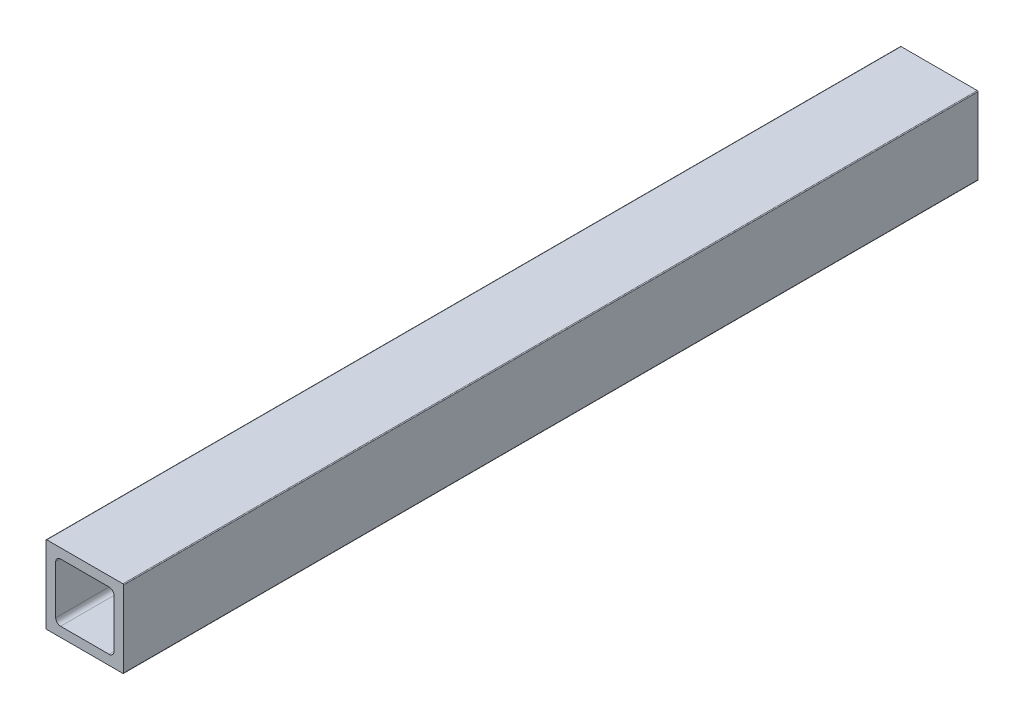
ISO-10303-21;
HEADER;
FILE_DESCRIPTION(('STEP AP214'),'2;1');
FILE_NAME('part.step','',(''),(''),'','','');
FILE_SCHEMA(('AUTOMOTIVE_DESIGN { 1 0 10303 214 1 1 1 1 }'));
ENDSEC;
DATA;
#1=APPLICATION_CONTEXT('core data for automotive mechanical design processes');
#2=APPLICATION_PROTOCOL_DEFINITION('international standard','automotive_design',2000,#1);
#3=PRODUCT_CONTEXT('',#1,'mechanical');
#4=PRODUCT('Part','Part','',(#3));
#5=PRODUCT_RELATED_PRODUCT_CATEGORY('part','',(#4));
#6=PRODUCT_DEFINITION_FORMATION('','',#4);
#7=PRODUCT_DEFINITION_CONTEXT('part definition',#1,'design');
#8=PRODUCT_DEFINITION('design','',#6,#7);
#9=PRODUCT_DEFINITION_SHAPE('','',#8);
#10=(LENGTH_UNIT() NAMED_UNIT(*) SI_UNIT(.MILLI.,.METRE.));
#11=(NAMED_UNIT(*) PLANE_ANGLE_UNIT() SI_UNIT($,.RADIAN.));
#12=(NAMED_UNIT(*) SI_UNIT($,.STERADIAN.) SOLID_ANGLE_UNIT());
#13=UNCERTAINTY_MEASURE_WITH_UNIT(LENGTH_MEASURE(1.E-05),#10,'distance_accuracy_value','');
#14=(GEOMETRIC_REPRESENTATION_CONTEXT(3) GLOBAL_UNCERTAINTY_ASSIGNED_CONTEXT((#13)) GLOBAL_UNIT_ASSIGNED_CONTEXT((#10,
#11,#12)) REPRESENTATION_CONTEXT('',''));
#15=CARTESIAN_POINT('',(0.,0.,0.));
#16=DIRECTION('',(0.,0.,1.));
#17=DIRECTION('',(1.,0.,0.));
#18=AXIS2_PLACEMENT_3D('',#15,#16,#17);
#19=CARTESIAN_POINT('',(0.254,0.254,0.));
#20=DIRECTION('',(0.,0.,-1.));
#21=DIRECTION('',(0.,-1.,0.));
#22=AXIS2_PLACEMENT_3D('',#19,#20,#21);
#23=PLANE('',#22);
#24=CARTESIAN_POINT('',(0.254,0.254,0.));
#25=DIRECTION('',(0.,0.,1.));
#26=DIRECTION('',(-1.,0.,0.));
#27=AXIS2_PLACEMENT_3D('',#24,#25,#26);
#28=CIRCLE('',#27,0.254);
#29=CARTESIAN_POINT('',(0.,0.254,0.));
#30=VERTEX_POINT('',#29);
#31=CARTESIAN_POINT('',(0.254,0.,0.));
#32=VERTEX_POINT('',#31);
#33=EDGE_CURVE('E193',#30,#32,#28,.T.);
#34=ORIENTED_EDGE('',*,*,#33,.F.);
#35=DIRECTION('',(0.,-1.,0.));
#36=VECTOR('',#35,1.);
#37=CARTESIAN_POINT('',(0.,0.254,0.));
#38=LINE('',#37,#36);
#39=CARTESIAN_POINT('',(0.,25.146,0.));
#40=VERTEX_POINT('',#39);
#41=EDGE_CURVE('E191',#40,#30,#38,.T.);
#42=ORIENTED_EDGE('',*,*,#41,.F.);
#43=CARTESIAN_POINT('',(0.254,25.146,0.));
#44=DIRECTION('',(0.,0.,1.));
#45=DIRECTION('',(-1.,0.,0.));
#46=AXIS2_PLACEMENT_3D('',#43,#44,#45);
#47=CIRCLE('',#46,0.254);
#48=CARTESIAN_POINT('',(0.254,25.4,0.));
#49=VERTEX_POINT('',#48);
#50=EDGE_CURVE('E213',#49,#40,#47,.T.);
#51=ORIENTED_EDGE('',*,*,#50,.F.);
#52=DIRECTION('',(-1.,0.,0.));
#53=VECTOR('',#52,1.);
#54=CARTESIAN_POINT('',(0.254,25.4,0.));
#55=LINE('',#54,#53);
#56=CARTESIAN_POINT('',(25.146,25.4,0.));
#57=VERTEX_POINT('',#56);
#58=EDGE_CURVE('E204',#57,#49,#55,.T.);
#59=ORIENTED_EDGE('',*,*,#58,.F.);
#60=CARTESIAN_POINT('',(25.146,25.146,0.));
#61=DIRECTION('',(0.,0.,1.));
#62=DIRECTION('',(-1.,0.,0.));
#63=AXIS2_PLACEMENT_3D('',#60,#61,#62);
#64=CIRCLE('',#63,0.254);
#65=CARTESIAN_POINT('',(25.4,25.146,0.));
#66=VERTEX_POINT('',#65);
#67=EDGE_CURVE('E236',#66,#57,#64,.T.);
#68=ORIENTED_EDGE('',*,*,#67,.F.);
#69=DIRECTION('',(0.,1.,0.));
#70=VECTOR('',#69,1.);
#71=CARTESIAN_POINT('',(25.4,0.254,0.));
#72=LINE('',#71,#70);
#73=CARTESIAN_POINT('',(25.4,0.254,0.));
#74=VERTEX_POINT('',#73);
#75=EDGE_CURVE('E235',#74,#66,#72,.T.);
#76=ORIENTED_EDGE('',*,*,#75,.F.);
#77=CARTESIAN_POINT('',(25.146,0.254,0.));
#78=DIRECTION('',(0.,0.,1.));
#79=DIRECTION('',(1.,0.,0.));
#80=AXIS2_PLACEMENT_3D('',#77,#78,#79);
#81=CIRCLE('',#80,0.254);
#82=CARTESIAN_POINT('',(25.146,0.,0.));
#83=VERTEX_POINT('',#82);
#84=EDGE_CURVE('E206',#83,#74,#81,.T.);
#85=ORIENTED_EDGE('',*,*,#84,.F.);
#86=DIRECTION('',(1.,0.,0.));
#87=VECTOR('',#86,1.);
#88=CARTESIAN_POINT('',(0.254,0.,0.));
#89=LINE('',#88,#87);
#90=EDGE_CURVE('E194',#32,#83,#89,.T.);
#91=ORIENTED_EDGE('',*,*,#90,.F.);
#92=EDGE_LOOP('',(#34,#42,#51,#59,#68,#76,#85,#91));
#93=FACE_BOUND('',#92,.T.);
#94=DIRECTION('',(0.,-1.,0.));
#95=VECTOR('',#94,1.);
#96=CARTESIAN_POINT('',(3.175,4.7625,0.));
#97=LINE('',#96,#95);
#98=CARTESIAN_POINT('',(3.175,20.6375,0.));
#99=VERTEX_POINT('',#98);
#100=CARTESIAN_POINT('',(3.175,4.7625,0.));
#101=VERTEX_POINT('',#100);
#102=EDGE_CURVE('E52',#99,#101,#97,.T.);
#103=ORIENTED_EDGE('',*,*,#102,.T.);
#104=CARTESIAN_POINT('',(4.7625,4.7625,0.));
#105=DIRECTION('',(0.,0.,1.));
#106=DIRECTION('',(1.,0.,0.));
#107=AXIS2_PLACEMENT_3D('',#104,#105,#106);
#108=CIRCLE('',#107,1.5875);
#109=CARTESIAN_POINT('',(4.7625,3.175,0.));
#110=VERTEX_POINT('',#109);
#111=EDGE_CURVE('E266',#101,#110,#108,.T.);
#112=ORIENTED_EDGE('',*,*,#111,.T.);
#113=DIRECTION('',(1.,0.,0.));
#114=VECTOR('',#113,1.);
#115=CARTESIAN_POINT('',(4.7625,3.175,0.));
#116=LINE('',#115,#114);
#117=CARTESIAN_POINT('',(20.6375,3.175,0.));
#118=VERTEX_POINT('',#117);
#119=EDGE_CURVE('E250',#110,#118,#116,.T.);
#120=ORIENTED_EDGE('',*,*,#119,.T.);
#121=CARTESIAN_POINT('',(20.6375,4.7625,0.));
#122=DIRECTION('',(0.,0.,1.));
#123=DIRECTION('',(-1.,0.,0.));
#124=AXIS2_PLACEMENT_3D('',#121,#122,#123);
#125=CIRCLE('',#124,1.5875);
#126=CARTESIAN_POINT('',(22.225,4.7625,0.));
#127=VERTEX_POINT('',#126);
#128=EDGE_CURVE('E223',#118,#127,#125,.T.);
#129=ORIENTED_EDGE('',*,*,#128,.T.);
#130=DIRECTION('',(0.,1.,0.));
#131=VECTOR('',#130,1.);
#132=CARTESIAN_POINT('',(22.225,4.7625,0.));
#133=LINE('',#132,#131);
#134=CARTESIAN_POINT('',(22.225,20.6375,0.));
#135=VERTEX_POINT('',#134);
#136=EDGE_CURVE('E219',#127,#135,#133,.T.);
#137=ORIENTED_EDGE('',*,*,#136,.T.);
#138=CARTESIAN_POINT('',(20.6375,20.6375,0.));
#139=DIRECTION('',(0.,0.,1.));
#140=DIRECTION('',(-1.,0.,0.));
#141=AXIS2_PLACEMENT_3D('',#138,#139,#140);
#142=CIRCLE('',#141,1.5875);
#143=CARTESIAN_POINT('',(20.6375,22.225,0.));
#144=VERTEX_POINT('',#143);
#145=EDGE_CURVE('E224',#135,#144,#142,.T.);
#146=ORIENTED_EDGE('',*,*,#145,.T.);
#147=DIRECTION('',(-1.,0.,0.));
#148=VECTOR('',#147,1.);
#149=CARTESIAN_POINT('',(4.7625,22.225,0.));
#150=LINE('',#149,#148);
#151=CARTESIAN_POINT('',(4.7625,22.225,0.));
#152=VERTEX_POINT('',#151);
#153=EDGE_CURVE('E229',#144,#152,#150,.T.);
#154=ORIENTED_EDGE('',*,*,#153,.T.);
#155=CARTESIAN_POINT('',(4.7625,20.6375,0.));
#156=DIRECTION('',(0.,0.,1.));
#157=DIRECTION('',(-1.,0.,0.));
#158=AXIS2_PLACEMENT_3D('',#155,#156,#157);
#159=CIRCLE('',#158,1.5875);
#160=EDGE_CURVE('E197',#152,#99,#159,.T.);
#161=ORIENTED_EDGE('',*,*,#160,.T.);
#162=EDGE_LOOP('',(#103,#112,#120,#129,#137,#146,#154,#161));
#163=FACE_BOUND('',#162,.T.);
#164=ADVANCED_FACE('F44',(#93,#163),#23,.T.);
#165=CARTESIAN_POINT('',(0.254,0.254,1828.8));
#166=DIRECTION('',(0.,0.,-1.));
#167=DIRECTION('',(-1.,0.,0.));
#168=AXIS2_PLACEMENT_3D('',#165,#166,#167);
#169=CYLINDRICAL_SURFACE('',#168,0.254);
#170=CARTESIAN_POINT('',(0.254,0.254,279.4));
#171=DIRECTION('',(0.,0.,-1.));
#172=DIRECTION('',(-1.,0.,0.));
#173=AXIS2_PLACEMENT_3D('',#170,#171,#172);
#174=CIRCLE('',#173,0.254);
#175=CARTESIAN_POINT('',(0.,0.254,279.4));
#176=VERTEX_POINT('',#175);
#177=CARTESIAN_POINT('',(0.254,0.,279.4));
#178=VERTEX_POINT('',#177);
#179=EDGE_CURVE('E172',#176,#178,#174,.F.);
#180=ORIENTED_EDGE('',*,*,#179,.F.);
#181=DIRECTION('',(0.,0.,-1.));
#182=VECTOR('',#181,1.);
#183=CARTESIAN_POINT('',(0.,0.254,1828.8));
#184=LINE('',#183,#182);
#185=EDGE_CURVE('E183',#176,#30,#184,.T.);
#186=ORIENTED_EDGE('',*,*,#185,.T.);
#187=ORIENTED_EDGE('',*,*,#33,.T.);
#188=DIRECTION('',(0.,0.,-1.));
#189=VECTOR('',#188,1.);
#190=CARTESIAN_POINT('',(0.254,0.,1828.8));
#191=LINE('',#190,#189);
#192=EDGE_CURVE('E185',#178,#32,#191,.T.);
#193=ORIENTED_EDGE('',*,*,#192,.F.);
#194=EDGE_LOOP('',(#180,#186,#187,#193));
#195=FACE_BOUND('',#194,.T.);
#196=ADVANCED_FACE('F181',(#195),#169,.T.);
#197=CARTESIAN_POINT('',(0.254,0.,1828.8));
#198=DIRECTION('',(0.,1.,0.));
#199=DIRECTION('',(1.,0.,0.));
#200=AXIS2_PLACEMENT_3D('',#197,#198,#199);
#201=PLANE('',#200);
#202=DIRECTION('',(0.,0.,-1.));
#203=VECTOR('',#202,1.);
#204=CARTESIAN_POINT('',(25.146,0.,1828.8));
#205=LINE('',#204,#203);
#206=CARTESIAN_POINT('',(25.146,0.,279.4));
#207=VERTEX_POINT('',#206);
#208=EDGE_CURVE('E210',#207,#83,#205,.T.);
#209=ORIENTED_EDGE('',*,*,#208,.F.);
#210=DIRECTION('',(1.,0.,0.));
#211=VECTOR('',#210,1.);
#212=CARTESIAN_POINT('',(0.,0.,279.4));
#213=LINE('',#212,#211);
#214=EDGE_CURVE('E177',#178,#207,#213,.T.);
#215=ORIENTED_EDGE('',*,*,#214,.F.);
#216=ORIENTED_EDGE('',*,*,#192,.T.);
#217=ORIENTED_EDGE('',*,*,#90,.T.);
#218=EDGE_LOOP('',(#209,#215,#216,#217));
#219=FACE_BOUND('',#218,.T.);
#220=ADVANCED_FACE('F289',(#219),#201,.F.);
#221=CARTESIAN_POINT('',(25.146,0.254,1828.8));
#222=DIRECTION('',(0.,0.,-1.));
#223=DIRECTION('',(-1.,0.,0.));
#224=AXIS2_PLACEMENT_3D('',#221,#222,#223);
#225=CYLINDRICAL_SURFACE('',#224,0.254);
#226=CARTESIAN_POINT('',(25.146,0.254,279.4));
#227=DIRECTION('',(0.,0.,-1.));
#228=DIRECTION('',(-1.,0.,0.));
#229=AXIS2_PLACEMENT_3D('',#226,#227,#228);
#230=CIRCLE('',#229,0.254);
#231=CARTESIAN_POINT('',(25.4,0.254,279.4));
#232=VERTEX_POINT('',#231);
#233=EDGE_CURVE('E187',#207,#232,#230,.F.);
#234=ORIENTED_EDGE('',*,*,#233,.F.);
#235=ORIENTED_EDGE('',*,*,#208,.T.);
#236=ORIENTED_EDGE('',*,*,#84,.T.);
#237=DIRECTION('',(0.,0.,-1.));
#238=VECTOR('',#237,1.);
#239=CARTESIAN_POINT('',(25.4,0.254,1828.8));
#240=LINE('',#239,#238);
#241=EDGE_CURVE('E233',#232,#74,#240,.T.);
#242=ORIENTED_EDGE('',*,*,#241,.F.);
#243=EDGE_LOOP('',(#234,#235,#236,#242));
#244=FACE_BOUND('',#243,.T.);
#245=ADVANCED_FACE('F283',(#244),#225,.T.);
#246=CARTESIAN_POINT('',(25.4,0.254,1828.8));
#247=DIRECTION('',(-1.,0.,0.));
#248=DIRECTION('',(0.,0.,1.));
#249=AXIS2_PLACEMENT_3D('',#246,#247,#248);
#250=PLANE('',#249);
#251=DIRECTION('',(0.,0.,-1.));
#252=VECTOR('',#251,1.);
#253=CARTESIAN_POINT('',(25.4,25.146,1828.8));
#254=LINE('',#253,#252);
#255=CARTESIAN_POINT('',(25.4,25.146,279.4));
#256=VERTEX_POINT('',#255);
#257=EDGE_CURVE('E258',#256,#66,#254,.T.);
#258=ORIENTED_EDGE('',*,*,#257,.F.);
#259=DIRECTION('',(0.,1.,0.));
#260=VECTOR('',#259,1.);
#261=CARTESIAN_POINT('',(25.4,0.,279.4));
#262=LINE('',#261,#260);
#263=EDGE_CURVE('E498',#232,#256,#262,.T.);
#264=ORIENTED_EDGE('',*,*,#263,.F.);
#265=ORIENTED_EDGE('',*,*,#241,.T.);
#266=ORIENTED_EDGE('',*,*,#75,.T.);
#267=EDGE_LOOP('',(#258,#264,#265,#266));
#268=FACE_BOUND('',#267,.T.);
#269=ADVANCED_FACE('F288',(#268),#250,.F.);
#270=CARTESIAN_POINT('',(25.146,25.146,1828.8));
#271=DIRECTION('',(0.,0.,-1.));
#272=DIRECTION('',(-1.,0.,0.));
#273=AXIS2_PLACEMENT_3D('',#270,#271,#272);
#274=CYLINDRICAL_SURFACE('',#273,0.254);
#275=CARTESIAN_POINT('',(25.146,25.146,279.4));
#276=DIRECTION('',(0.,0.,-1.));
#277=DIRECTION('',(-1.,0.,0.));
#278=AXIS2_PLACEMENT_3D('',#275,#276,#277);
#279=CIRCLE('',#278,0.254);
#280=CARTESIAN_POINT('',(25.146,25.4,279.4));
#281=VERTEX_POINT('',#280);
#282=EDGE_CURVE('E492',#256,#281,#279,.F.);
#283=ORIENTED_EDGE('',*,*,#282,.F.);
#284=ORIENTED_EDGE('',*,*,#257,.T.);
#285=ORIENTED_EDGE('',*,*,#67,.T.);
#286=DIRECTION('',(0.,0.,-1.));
#287=VECTOR('',#286,1.);
#288=CARTESIAN_POINT('',(25.146,25.4,1828.8));
#289=LINE('',#288,#287);
#290=EDGE_CURVE('E227',#281,#57,#289,.T.);
#291=ORIENTED_EDGE('',*,*,#290,.F.);
#292=EDGE_LOOP('',(#283,#284,#285,#291));
#293=FACE_BOUND('',#292,.T.);
#294=ADVANCED_FACE('F46',(#293),#274,.T.);
#295=CARTESIAN_POINT('',(0.254,25.4,1828.8));
#296=DIRECTION('',(0.,-1.,0.));
#297=DIRECTION('',(0.,0.,-1.));
#298=AXIS2_PLACEMENT_3D('',#295,#296,#297);
#299=PLANE('',#298);
#300=DIRECTION('',(0.,0.,-1.));
#301=VECTOR('',#300,1.);
#302=CARTESIAN_POINT('',(0.254,25.4,1828.8));
#303=LINE('',#302,#301);
#304=CARTESIAN_POINT('',(0.254,25.4,279.4));
#305=VERTEX_POINT('',#304);
#306=EDGE_CURVE('E211',#305,#49,#303,.T.);
#307=ORIENTED_EDGE('',*,*,#306,.F.);
#308=DIRECTION('',(-1.,0.,0.));
#309=VECTOR('',#308,1.);
#310=CARTESIAN_POINT('',(0.,25.4,279.4));
#311=LINE('',#310,#309);
#312=EDGE_CURVE('E545',#281,#305,#311,.T.);
#313=ORIENTED_EDGE('',*,*,#312,.F.);
#314=ORIENTED_EDGE('',*,*,#290,.T.);
#315=ORIENTED_EDGE('',*,*,#58,.T.);
#316=EDGE_LOOP('',(#307,#313,#314,#315));
#317=FACE_BOUND('',#316,.T.);
#318=ADVANCED_FACE('F347',(#317),#299,.F.);
#319=CARTESIAN_POINT('',(0.254,25.146,1828.8));
#320=DIRECTION('',(0.,0.,-1.));
#321=DIRECTION('',(-1.,0.,0.));
#322=AXIS2_PLACEMENT_3D('',#319,#320,#321);
#323=CYLINDRICAL_SURFACE('',#322,0.254);
#324=CARTESIAN_POINT('',(0.254,25.146,279.4));
#325=DIRECTION('',(0.,0.,-1.));
#326=DIRECTION('',(-1.,0.,0.));
#327=AXIS2_PLACEMENT_3D('',#324,#325,#326);
#328=CIRCLE('',#327,0.254);
#329=CARTESIAN_POINT('',(0.,25.146,279.4));
#330=VERTEX_POINT('',#329);
#331=EDGE_CURVE('E59',#305,#330,#328,.F.);
#332=ORIENTED_EDGE('',*,*,#331,.F.);
#333=ORIENTED_EDGE('',*,*,#306,.T.);
#334=ORIENTED_EDGE('',*,*,#50,.T.);
#335=DIRECTION('',(0.,0.,-1.));
#336=VECTOR('',#335,1.);
#337=CARTESIAN_POINT('',(0.,25.146,1828.8));
#338=LINE('',#337,#336);
#339=EDGE_CURVE('E216',#330,#40,#338,.T.);
#340=ORIENTED_EDGE('',*,*,#339,.F.);
#341=EDGE_LOOP('',(#332,#333,#334,#340));
#342=FACE_BOUND('',#341,.T.);
#343=ADVANCED_FACE('F276',(#342),#323,.T.);
#344=CARTESIAN_POINT('',(0.,0.254,1828.8));
#345=DIRECTION('',(1.,0.,0.));
#346=DIRECTION('',(0.,1.,0.));
#347=AXIS2_PLACEMENT_3D('',#344,#345,#346);
#348=PLANE('',#347);
#349=ORIENTED_EDGE('',*,*,#185,.F.);
#350=DIRECTION('',(0.,-1.,0.));
#351=VECTOR('',#350,1.);
#352=CARTESIAN_POINT('',(0.,0.,279.4));
#353=LINE('',#352,#351);
#354=EDGE_CURVE('E169',#330,#176,#353,.T.);
#355=ORIENTED_EDGE('',*,*,#354,.F.);
#356=ORIENTED_EDGE('',*,*,#339,.T.);
#357=ORIENTED_EDGE('',*,*,#41,.T.);
#358=EDGE_LOOP('',(#349,#355,#356,#357));
#359=FACE_BOUND('',#358,.T.);
#360=ADVANCED_FACE('F189',(#359),#348,.F.);
#361=CARTESIAN_POINT('',(4.7625,4.7625,1828.8));
#362=DIRECTION('',(0.,0.,-1.));
#363=DIRECTION('',(-1.,0.,0.));
#364=AXIS2_PLACEMENT_3D('',#361,#362,#363);
#365=CYLINDRICAL_SURFACE('',#364,1.5875);
#366=DIRECTION('',(0.,0.,-1.));
#367=VECTOR('',#366,1.);
#368=CARTESIAN_POINT('',(3.175,4.7625,1828.8));
#369=LINE('',#368,#367);
#370=CARTESIAN_POINT('',(3.175,4.7625,279.4));
#371=VERTEX_POINT('',#370);
#372=EDGE_CURVE('E186',#371,#101,#369,.T.);
#373=ORIENTED_EDGE('',*,*,#372,.F.);
#374=CARTESIAN_POINT('',(4.7625,4.7625,279.4));
#375=DIRECTION('',(0.,0.,-1.));
#376=DIRECTION('',(-1.,0.,0.));
#377=AXIS2_PLACEMENT_3D('',#374,#375,#376);
#378=CIRCLE('',#377,1.5875);
#379=CARTESIAN_POINT('',(4.7625,3.175,279.4));
#380=VERTEX_POINT('',#379);
#381=EDGE_CURVE('E66',#371,#380,#378,.F.);
#382=ORIENTED_EDGE('',*,*,#381,.T.);
#383=DIRECTION('',(0.,0.,-1.));
#384=VECTOR('',#383,1.);
#385=CARTESIAN_POINT('',(4.7625,3.175,1828.8));
#386=LINE('',#385,#384);
#387=EDGE_CURVE('E214',#380,#110,#386,.T.);
#388=ORIENTED_EDGE('',*,*,#387,.T.);
#389=ORIENTED_EDGE('',*,*,#111,.F.);
#390=EDGE_LOOP('',(#373,#382,#388,#389));
#391=FACE_BOUND('',#390,.T.);
#392=ADVANCED_FACE('F275',(#391),#365,.F.);
#393=CARTESIAN_POINT('',(4.7625,3.175,1828.8));
#394=DIRECTION('',(0.,1.,0.));
#395=DIRECTION('',(1.,0.,0.));
#396=AXIS2_PLACEMENT_3D('',#393,#394,#395);
#397=PLANE('',#396);
#398=DIRECTION('',(-1.,0.,0.));
#399=VECTOR('',#398,1.);
#400=CARTESIAN_POINT('',(4.7625,3.175,279.4));
#401=LINE('',#400,#399);
#402=CARTESIAN_POINT('',(20.6375,3.175,279.4));
#403=VERTEX_POINT('',#402);
#404=EDGE_CURVE('E532',#403,#380,#401,.T.);
#405=ORIENTED_EDGE('',*,*,#404,.F.);
#406=DIRECTION('',(0.,0.,-1.));
#407=VECTOR('',#406,1.);
#408=CARTESIAN_POINT('',(20.6375,3.175,1828.8));
#409=LINE('',#408,#407);
#410=EDGE_CURVE('E217',#403,#118,#409,.T.);
#411=ORIENTED_EDGE('',*,*,#410,.T.);
#412=ORIENTED_EDGE('',*,*,#119,.F.);
#413=ORIENTED_EDGE('',*,*,#387,.F.);
#414=EDGE_LOOP('',(#405,#411,#412,#413));
#415=FACE_BOUND('',#414,.T.);
#416=ADVANCED_FACE('F302',(#415),#397,.T.);
#417=CARTESIAN_POINT('',(20.6375,4.7625,1828.8));
#418=DIRECTION('',(0.,0.,-1.));
#419=DIRECTION('',(-1.,0.,0.));
#420=AXIS2_PLACEMENT_3D('',#417,#418,#419);
#421=CYLINDRICAL_SURFACE('',#420,1.5875);
#422=ORIENTED_EDGE('',*,*,#410,.F.);
#423=CARTESIAN_POINT('',(20.6375,4.7625,279.4));
#424=DIRECTION('',(0.,0.,-1.));
#425=DIRECTION('',(-1.,0.,0.));
#426=AXIS2_PLACEMENT_3D('',#423,#424,#425);
#427=CIRCLE('',#426,1.5875);
#428=CARTESIAN_POINT('',(22.225,4.7625,279.4));
#429=VERTEX_POINT('',#428);
#430=EDGE_CURVE('E513',#403,#429,#427,.F.);
#431=ORIENTED_EDGE('',*,*,#430,.T.);
#432=DIRECTION('',(0.,0.,-1.));
#433=VECTOR('',#432,1.);
#434=CARTESIAN_POINT('',(22.225,4.7625,1828.8));
#435=LINE('',#434,#433);
#436=EDGE_CURVE('E254',#429,#127,#435,.T.);
#437=ORIENTED_EDGE('',*,*,#436,.T.);
#438=ORIENTED_EDGE('',*,*,#128,.F.);
#439=EDGE_LOOP('',(#422,#431,#437,#438));
#440=FACE_BOUND('',#439,.T.);
#441=ADVANCED_FACE('F297',(#440),#421,.F.);
#442=CARTESIAN_POINT('',(22.225,4.7625,1828.8));
#443=DIRECTION('',(-1.,0.,0.));
#444=DIRECTION('',(0.,0.,1.));
#445=AXIS2_PLACEMENT_3D('',#442,#443,#444);
#446=PLANE('',#445);
#447=DIRECTION('',(0.,-1.,0.));
#448=VECTOR('',#447,1.);
#449=CARTESIAN_POINT('',(22.225,4.7625,279.4));
#450=LINE('',#449,#448);
#451=CARTESIAN_POINT('',(22.225,20.6375,279.4));
#452=VERTEX_POINT('',#451);
#453=EDGE_CURVE('E535',#452,#429,#450,.T.);
#454=ORIENTED_EDGE('',*,*,#453,.F.);
#455=DIRECTION('',(0.,0.,-1.));
#456=VECTOR('',#455,1.);
#457=CARTESIAN_POINT('',(22.225,20.6375,1828.8));
#458=LINE('',#457,#456);
#459=EDGE_CURVE('E240',#452,#135,#458,.T.);
#460=ORIENTED_EDGE('',*,*,#459,.T.);
#461=ORIENTED_EDGE('',*,*,#136,.F.);
#462=ORIENTED_EDGE('',*,*,#436,.F.);
#463=EDGE_LOOP('',(#454,#460,#461,#462));
#464=FACE_BOUND('',#463,.T.);
#465=ADVANCED_FACE('F301',(#464),#446,.T.);
#466=CARTESIAN_POINT('',(20.6375,20.6375,1828.8));
#467=DIRECTION('',(0.,0.,-1.));
#468=DIRECTION('',(-1.,0.,0.));
#469=AXIS2_PLACEMENT_3D('',#466,#467,#468);
#470=CYLINDRICAL_SURFACE('',#469,1.5875);
#471=ORIENTED_EDGE('',*,*,#459,.F.);
#472=CARTESIAN_POINT('',(20.6375,20.6375,279.4));
#473=DIRECTION('',(0.,0.,-1.));
#474=DIRECTION('',(-1.,0.,0.));
#475=AXIS2_PLACEMENT_3D('',#472,#473,#474);
#476=CIRCLE('',#475,1.5875);
#477=CARTESIAN_POINT('',(20.6375,22.225,279.4));
#478=VERTEX_POINT('',#477);
#479=EDGE_CURVE('E537',#452,#478,#476,.F.);
#480=ORIENTED_EDGE('',*,*,#479,.T.);
#481=DIRECTION('',(0.,0.,-1.));
#482=VECTOR('',#481,1.);
#483=CARTESIAN_POINT('',(20.6375,22.225,1828.8));
#484=LINE('',#483,#482);
#485=EDGE_CURVE('E238',#478,#144,#484,.T.);
#486=ORIENTED_EDGE('',*,*,#485,.T.);
#487=ORIENTED_EDGE('',*,*,#145,.F.);
#488=EDGE_LOOP('',(#471,#480,#486,#487));
#489=FACE_BOUND('',#488,.T.);
#490=ADVANCED_FACE('F309',(#489),#470,.F.);
#491=CARTESIAN_POINT('',(4.7625,22.225,1828.8));
#492=DIRECTION('',(0.,-1.,0.));
#493=DIRECTION('',(0.,0.,-1.));
#494=AXIS2_PLACEMENT_3D('',#491,#492,#493);
#495=PLANE('',#494);
#496=DIRECTION('',(1.,0.,0.));
#497=VECTOR('',#496,1.);
#498=CARTESIAN_POINT('',(4.7625,22.225,279.4));
#499=LINE('',#498,#497);
#500=CARTESIAN_POINT('',(4.7625,22.225,279.4));
#501=VERTEX_POINT('',#500);
#502=EDGE_CURVE('E540',#501,#478,#499,.T.);
#503=ORIENTED_EDGE('',*,*,#502,.F.);
#504=DIRECTION('',(0.,0.,-1.));
#505=VECTOR('',#504,1.);
#506=CARTESIAN_POINT('',(4.7625,22.225,1828.8));
#507=LINE('',#506,#505);
#508=EDGE_CURVE('E241',#501,#152,#507,.T.);
#509=ORIENTED_EDGE('',*,*,#508,.T.);
#510=ORIENTED_EDGE('',*,*,#153,.F.);
#511=ORIENTED_EDGE('',*,*,#485,.F.);
#512=EDGE_LOOP('',(#503,#509,#510,#511));
#513=FACE_BOUND('',#512,.T.);
#514=ADVANCED_FACE('F313',(#513),#495,.T.);
#515=CARTESIAN_POINT('',(4.7625,20.6375,1828.8));
#516=DIRECTION('',(0.,0.,-1.));
#517=DIRECTION('',(-1.,0.,0.));
#518=AXIS2_PLACEMENT_3D('',#515,#516,#517);
#519=CYLINDRICAL_SURFACE('',#518,1.5875);
#520=ORIENTED_EDGE('',*,*,#508,.F.);
#521=CARTESIAN_POINT('',(4.7625,20.6375,279.4));
#522=DIRECTION('',(0.,0.,-1.));
#523=DIRECTION('',(-1.,0.,0.));
#524=AXIS2_PLACEMENT_3D('',#521,#522,#523);
#525=CIRCLE('',#524,1.5875);
#526=CARTESIAN_POINT('',(3.175,20.6375,279.4));
#527=VERTEX_POINT('',#526);
#528=EDGE_CURVE('E542',#501,#527,#525,.F.);
#529=ORIENTED_EDGE('',*,*,#528,.T.);
#530=DIRECTION('',(0.,0.,-1.));
#531=VECTOR('',#530,1.);
#532=CARTESIAN_POINT('',(3.175,20.6375,1828.8));
#533=LINE('',#532,#531);
#534=EDGE_CURVE('E245',#527,#99,#533,.T.);
#535=ORIENTED_EDGE('',*,*,#534,.T.);
#536=ORIENTED_EDGE('',*,*,#160,.F.);
#537=EDGE_LOOP('',(#520,#529,#535,#536));
#538=FACE_BOUND('',#537,.T.);
#539=ADVANCED_FACE('F390',(#538),#519,.F.);
#540=CARTESIAN_POINT('',(3.175,4.7625,1828.8));
#541=DIRECTION('',(1.,0.,0.));
#542=DIRECTION('',(0.,1.,0.));
#543=AXIS2_PLACEMENT_3D('',#540,#541,#542);
#544=PLANE('',#543);
#545=DIRECTION('',(0.,1.,0.));
#546=VECTOR('',#545,1.);
#547=CARTESIAN_POINT('',(3.175,4.7625,279.4));
#548=LINE('',#547,#546);
#549=EDGE_CURVE('E11',#371,#527,#548,.T.);
#550=ORIENTED_EDGE('',*,*,#549,.F.);
#551=ORIENTED_EDGE('',*,*,#372,.T.);
#552=ORIENTED_EDGE('',*,*,#102,.F.);
#553=ORIENTED_EDGE('',*,*,#534,.F.);
#554=EDGE_LOOP('',(#550,#551,#552,#553));
#555=FACE_BOUND('',#554,.T.);
#556=ADVANCED_FACE('F394',(#555),#544,.T.);
#557=CARTESIAN_POINT('',(0.,0.,279.4));
#558=DIRECTION('',(0.,0.,-1.));
#559=DIRECTION('',(-1.,0.,0.));
#560=AXIS2_PLACEMENT_3D('',#557,#558,#559);
#561=PLANE('',#560);
#562=ORIENTED_EDGE('',*,*,#179,.T.);
#563=ORIENTED_EDGE('',*,*,#214,.T.);
#564=ORIENTED_EDGE('',*,*,#233,.T.);
#565=ORIENTED_EDGE('',*,*,#263,.T.);
#566=ORIENTED_EDGE('',*,*,#282,.T.);
#567=ORIENTED_EDGE('',*,*,#312,.T.);
#568=ORIENTED_EDGE('',*,*,#331,.T.);
#569=ORIENTED_EDGE('',*,*,#354,.T.);
#570=EDGE_LOOP('',(#562,#563,#564,#565,#566,#567,#568,#569));
#571=FACE_BOUND('',#570,.T.);
#572=ORIENTED_EDGE('',*,*,#549,.T.);
#573=ORIENTED_EDGE('',*,*,#528,.F.);
#574=ORIENTED_EDGE('',*,*,#502,.T.);
#575=ORIENTED_EDGE('',*,*,#479,.F.);
#576=ORIENTED_EDGE('',*,*,#453,.T.);
#577=ORIENTED_EDGE('',*,*,#430,.F.);
#578=ORIENTED_EDGE('',*,*,#404,.T.);
#579=ORIENTED_EDGE('',*,*,#381,.F.);
#580=EDGE_LOOP('',(#572,#573,#574,#575,#576,#577,#578,#579));
#581=FACE_BOUND('',#580,.T.);
#582=ADVANCED_FACE('F171',(#571,#581),#561,.F.);
#583=CLOSED_SHELL('',(#164,#196,#220,#245,#269,#294,#318,#343,#360,#392,#416,#441,#465,#490,
#514,#539,#556,#582));
#584=MANIFOLD_SOLID_BREP('B2',#583);
#585=ADVANCED_BREP_SHAPE_REPRESENTATION('',(#18,#584),#14);
#586=SHAPE_DEFINITION_REPRESENTATION(#9,#585);
ENDSEC;
END-ISO-10303-21;
